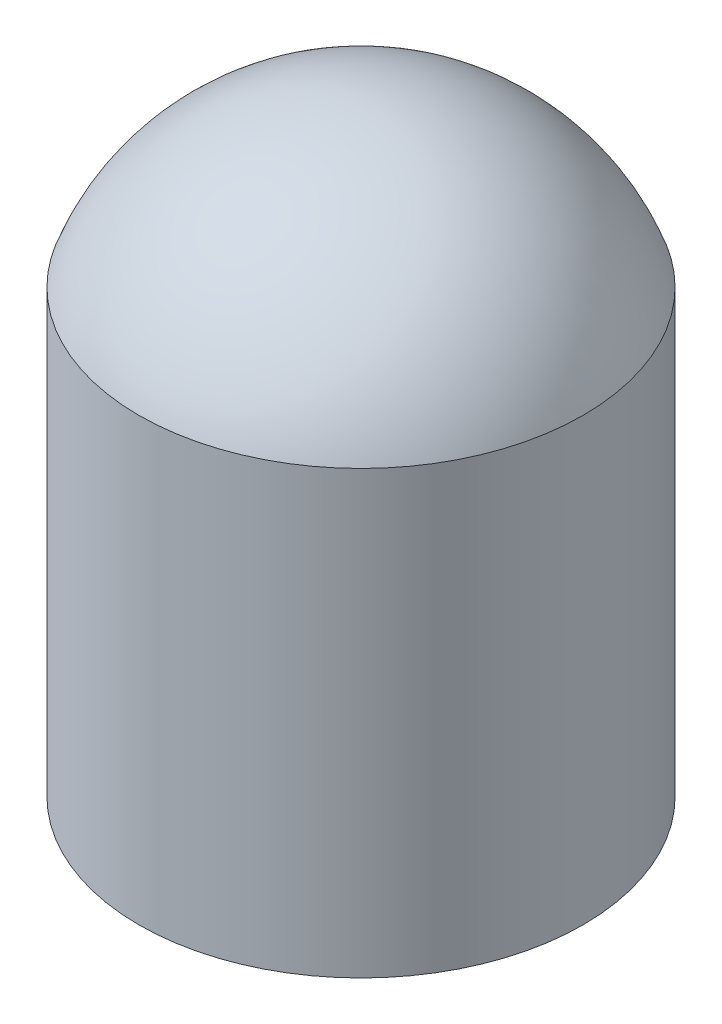
ISO-10303-21;
HEADER;
FILE_DESCRIPTION(('STEP AP214'),'2;1');
FILE_NAME('part.step','',(''),(''),'','','');
FILE_SCHEMA(('AUTOMOTIVE_DESIGN { 1 0 10303 214 1 1 1 1 }'));
ENDSEC;
DATA;
#1=APPLICATION_CONTEXT('core data for automotive mechanical design processes');
#2=APPLICATION_PROTOCOL_DEFINITION('international standard','automotive_design',2000,#1);
#3=PRODUCT_CONTEXT('',#1,'mechanical');
#4=PRODUCT('Part','Part','',(#3));
#5=PRODUCT_RELATED_PRODUCT_CATEGORY('part','',(#4));
#6=PRODUCT_DEFINITION_FORMATION('','',#4);
#7=PRODUCT_DEFINITION_CONTEXT('part definition',#1,'design');
#8=PRODUCT_DEFINITION('design','',#6,#7);
#9=PRODUCT_DEFINITION_SHAPE('','',#8);
#10=(LENGTH_UNIT() NAMED_UNIT(*) SI_UNIT(.MILLI.,.METRE.));
#11=(NAMED_UNIT(*) PLANE_ANGLE_UNIT() SI_UNIT($,.RADIAN.));
#12=(NAMED_UNIT(*) SI_UNIT($,.STERADIAN.) SOLID_ANGLE_UNIT());
#13=UNCERTAINTY_MEASURE_WITH_UNIT(LENGTH_MEASURE(1.E-05),#10,'distance_accuracy_value','');
#14=(GEOMETRIC_REPRESENTATION_CONTEXT(3) GLOBAL_UNCERTAINTY_ASSIGNED_CONTEXT((#13)) GLOBAL_UNIT_ASSIGNED_CONTEXT((#10,
#11,#12)) REPRESENTATION_CONTEXT('',''));
#15=CARTESIAN_POINT('',(0.,0.,0.));
#16=DIRECTION('',(0.,0.,1.));
#17=DIRECTION('',(1.,0.,0.));
#18=AXIS2_PLACEMENT_3D('',#15,#16,#17);
#19=CARTESIAN_POINT('',(0.,-3.,0.));
#20=DIRECTION('',(0.,-1.,0.));
#21=DIRECTION('',(1.,0.,0.));
#22=AXIS2_PLACEMENT_3D('',#19,#20,#21);
#23=SPHERICAL_SURFACE('',#22,3.);
#24=CARTESIAN_POINT('',(0.,-2.72211473857641,0.));
#25=DIRECTION('',(0.,-1.,0.));
#26=DIRECTION('',(0.,0.,-1.));
#27=AXIS2_PLACEMENT_3D('',#24,#25,#26);
#28=CIRCLE('',#27,2.98710223820403);
#29=CARTESIAN_POINT('',(0.,-2.72211473857641,-2.98710223820403));
#30=VERTEX_POINT('',#29);
#31=EDGE_CURVE('E10',#30,#30,#28,.T.);
#32=ORIENTED_EDGE('',*,*,#31,.T.);
#33=EDGE_LOOP('',(#32));
#34=FACE_BOUND('',#33,.T.);
#35=ADVANCED_FACE('F37',(#34),#23,.F.);
#36=CARTESIAN_POINT('',(2.98710223820403,-2.72211473857641,0.));
#37=DIRECTION('',(0.,-1.,0.));
#38=DIRECTION('',(0.,0.,-1.));
#39=AXIS2_PLACEMENT_3D('',#36,#37,#38);
#40=PLANE('',#39);
#41=CARTESIAN_POINT('',(0.,-2.72211473857641,0.));
#42=DIRECTION('',(0.,-1.,0.));
#43=DIRECTION('',(0.,0.,-1.));
#44=AXIS2_PLACEMENT_3D('',#41,#42,#43);
#45=CIRCLE('',#44,3.98710223820403);
#46=CARTESIAN_POINT('',(0.,-2.72211473857641,-3.98710223820403));
#47=VERTEX_POINT('',#46);
#48=EDGE_CURVE('E44',#47,#47,#45,.T.);
#49=ORIENTED_EDGE('',*,*,#48,.T.);
#50=EDGE_LOOP('',(#49));
#51=FACE_BOUND('',#50,.T.);
#52=ORIENTED_EDGE('',*,*,#31,.F.);
#53=EDGE_LOOP('',(#52));
#54=FACE_BOUND('',#53,.T.);
#55=ADVANCED_FACE('F66',(#51,#54),#40,.T.);
#56=CARTESIAN_POINT('',(0.,0.,0.));
#57=DIRECTION('',(0.,-1.,0.));
#58=DIRECTION('',(0.,0.,-1.));
#59=AXIS2_PLACEMENT_3D('',#56,#57,#58);
#60=CYLINDRICAL_SURFACE('',#59,3.98710223820403);
#61=CARTESIAN_POINT('',(0.,5.2,0.));
#62=DIRECTION('',(0.,-1.,0.));
#63=DIRECTION('',(0.,0.,-1.));
#64=AXIS2_PLACEMENT_3D('',#61,#62,#63);
#65=CIRCLE('',#64,3.98710223820403);
#66=CARTESIAN_POINT('',(0.,5.2,-3.98710223820403));
#67=VERTEX_POINT('',#66);
#68=EDGE_CURVE('E49',#67,#67,#65,.T.);
#69=ORIENTED_EDGE('',*,*,#68,.T.);
#70=EDGE_LOOP('',(#69));
#71=FACE_BOUND('',#70,.T.);
#72=ORIENTED_EDGE('',*,*,#48,.F.);
#73=EDGE_LOOP('',(#72));
#74=FACE_BOUND('',#73,.T.);
#75=ADVANCED_FACE('F57',(#71,#74),#60,.T.);
#76=CARTESIAN_POINT('',(0.,3.76125281109078,0.));
#77=DIRECTION('',(0.,-1.,0.));
#78=DIRECTION('',(1.,0.,0.));
#79=AXIS2_PLACEMENT_3D('',#76,#77,#78);
#80=SPHERICAL_SURFACE('',#79,4.23874718890922);
#81=ORIENTED_EDGE('',*,*,#68,.F.);
#82=EDGE_LOOP('',(#81));
#83=FACE_BOUND('',#82,.T.);
#84=ADVANCED_FACE('F60',(#83),#80,.T.);
#85=CLOSED_SHELL('',(#35,#55,#75,#84));
#86=MANIFOLD_SOLID_BREP('B2',#85);
#87=ADVANCED_BREP_SHAPE_REPRESENTATION('',(#18,#86),#14);
#88=SHAPE_DEFINITION_REPRESENTATION(#9,#87);
ENDSEC;
END-ISO-10303-21;
